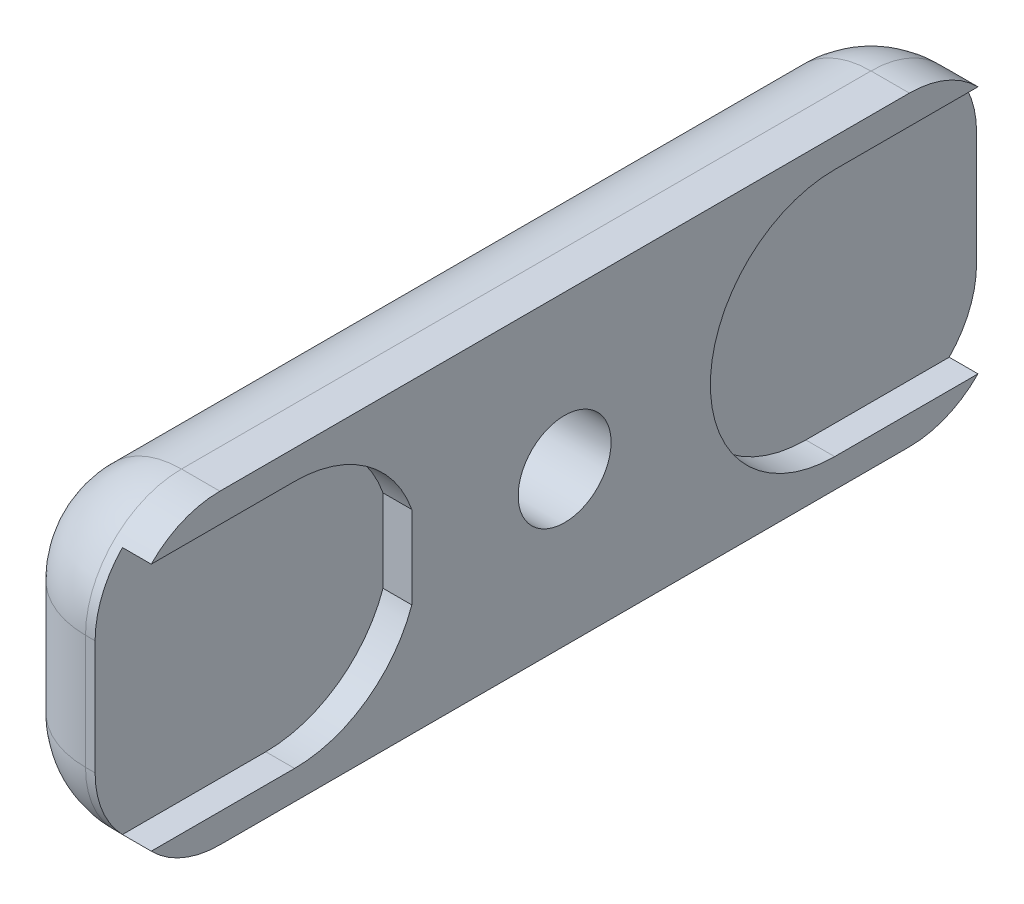
ISO-10303-21;
HEADER;
FILE_DESCRIPTION(('STEP AP214'),'2;1');
FILE_NAME('part.step','',(''),(''),'','','');
FILE_SCHEMA(('AUTOMOTIVE_DESIGN { 1 0 10303 214 1 1 1 1 }'));
ENDSEC;
DATA;
#1=APPLICATION_CONTEXT('core data for automotive mechanical design processes');
#2=APPLICATION_PROTOCOL_DEFINITION('international standard','automotive_design',2000,#1);
#3=PRODUCT_CONTEXT('',#1,'mechanical');
#4=PRODUCT('Part','Part','',(#3));
#5=PRODUCT_RELATED_PRODUCT_CATEGORY('part','',(#4));
#6=PRODUCT_DEFINITION_FORMATION('','',#4);
#7=PRODUCT_DEFINITION_CONTEXT('part definition',#1,'design');
#8=PRODUCT_DEFINITION('design','',#6,#7);
#9=PRODUCT_DEFINITION_SHAPE('','',#8);
#10=(LENGTH_UNIT() NAMED_UNIT(*) SI_UNIT(.MILLI.,.METRE.));
#11=(NAMED_UNIT(*) PLANE_ANGLE_UNIT() SI_UNIT($,.RADIAN.));
#12=(NAMED_UNIT(*) SI_UNIT($,.STERADIAN.) SOLID_ANGLE_UNIT());
#13=UNCERTAINTY_MEASURE_WITH_UNIT(LENGTH_MEASURE(1.E-05),#10,'distance_accuracy_value','');
#14=(GEOMETRIC_REPRESENTATION_CONTEXT(3) GLOBAL_UNCERTAINTY_ASSIGNED_CONTEXT((#13)) GLOBAL_UNIT_ASSIGNED_CONTEXT((#10,
#11,#12)) REPRESENTATION_CONTEXT('',''));
#15=CARTESIAN_POINT('',(0.,0.,0.));
#16=DIRECTION('',(0.,0.,1.));
#17=DIRECTION('',(1.,0.,0.));
#18=AXIS2_PLACEMENT_3D('',#15,#16,#17);
#19=CARTESIAN_POINT('',(14.,18.9686177509747,49.0539869213552));
#20=DIRECTION('',(0.,0.,-1.));
#21=DIRECTION('',(0.,1.,0.));
#22=AXIS2_PLACEMENT_3D('',#19,#20,#21);
#23=PLANE('',#22);
#24=DIRECTION('',(0.,-1.,0.));
#25=VECTOR('',#24,1.);
#26=CARTESIAN_POINT('',(11.,-12.95,49.0539869213552));
#27=LINE('',#26,#25);
#28=CARTESIAN_POINT('',(11.,5.95930887548733,49.0539869213552));
#29=VERTEX_POINT('',#28);
#30=CARTESIAN_POINT('',(11.,-5.95930887548734,49.0539869213552));
#31=VERTEX_POINT('',#30);
#32=EDGE_CURVE('E238',#29,#31,#27,.T.);
#33=ORIENTED_EDGE('',*,*,#32,.F.);
#34=DIRECTION('',(1.,0.,0.));
#35=VECTOR('',#34,1.);
#36=CARTESIAN_POINT('',(14.,5.95930887548733,49.0539869213552));
#37=LINE('',#36,#35);
#38=CARTESIAN_POINT('',(10.,5.95930887548733,49.0539869213552));
#39=VERTEX_POINT('',#38);
#40=EDGE_CURVE('E11',#29,#39,#37,.F.);
#41=ORIENTED_EDGE('',*,*,#40,.T.);
#42=DIRECTION('',(0.,-1.,0.));
#43=VECTOR('',#42,1.);
#44=CARTESIAN_POINT('',(10.,18.9686177509747,49.0539869213552));
#45=LINE('',#44,#43);
#46=CARTESIAN_POINT('',(10.,-5.95930887548733,49.0539869213552));
#47=VERTEX_POINT('',#46);
#48=EDGE_CURVE('E299',#39,#47,#45,.T.);
#49=ORIENTED_EDGE('',*,*,#48,.T.);
#50=DIRECTION('',(1.,0.,0.));
#51=VECTOR('',#50,1.);
#52=CARTESIAN_POINT('',(14.,-5.95930887548734,49.0539869213552));
#53=LINE('',#52,#51);
#54=EDGE_CURVE('E290',#47,#31,#53,.T.);
#55=ORIENTED_EDGE('',*,*,#54,.T.);
#56=EDGE_LOOP('',(#33,#41,#49,#55));
#57=FACE_BOUND('',#56,.T.);
#58=ADVANCED_FACE('F50',(#57),#23,.F.);
#59=CARTESIAN_POINT('',(14.,-28.9686177509747,3.13232637331732));
#60=DIRECTION('',(1.,0.,0.));
#61=DIRECTION('',(0.,0.,-1.));
#62=AXIS2_PLACEMENT_3D('',#59,#60,#61);
#63=PLANE('',#62);
#64=DIRECTION('',(0.,0.,-1.));
#65=VECTOR('',#64,1.);
#66=CARTESIAN_POINT('',(14.,12.95,-25.0030511371958));
#67=LINE('',#66,#65);
#68=CARTESIAN_POINT('',(14.,12.95,-25.0030511371958));
#69=VERTEX_POINT('',#68);
#70=CARTESIAN_POINT('',(14.,12.95,-39.9398752452733));
#71=VERTEX_POINT('',#70);
#72=EDGE_CURVE('E203',#69,#71,#67,.T.);
#73=ORIENTED_EDGE('',*,*,#72,.T.);
#74=CARTESIAN_POINT('',(14.,5.95930887548733,-32.7893341747207));
#75=DIRECTION('',(1.,0.,0.));
#76=DIRECTION('',(0.,0.,-1.));
#77=AXIS2_PLACEMENT_3D('',#74,#75,#76);
#78=CIRCLE('',#77,10.);
#79=CARTESIAN_POINT('',(14.,15.9593088754873,-32.7893341747207));
#80=VERTEX_POINT('',#79);
#81=EDGE_CURVE('E335',#71,#80,#78,.T.);
#82=ORIENTED_EDGE('',*,*,#81,.T.);
#83=DIRECTION('',(0.,0.,-1.));
#84=VECTOR('',#83,1.);
#85=CARTESIAN_POINT('',(14.,15.9593088754873,49.0539869213552));
#86=LINE('',#85,#84);
#87=CARTESIAN_POINT('',(14.,15.9593088754873,39.0539869213552));
#88=VERTEX_POINT('',#87);
#89=EDGE_CURVE('E298',#88,#80,#86,.T.);
#90=ORIENTED_EDGE('',*,*,#89,.F.);
#91=CARTESIAN_POINT('',(14.,5.95930887548733,39.0539869213552));
#92=DIRECTION('',(1.,0.,0.));
#93=DIRECTION('',(0.,0.,-1.));
#94=AXIS2_PLACEMENT_3D('',#91,#92,#93);
#95=CIRCLE('',#94,10.);
#96=CARTESIAN_POINT('',(14.,12.95,46.2045279919078));
#97=VERTEX_POINT('',#96);
#98=EDGE_CURVE('E332',#88,#97,#95,.T.);
#99=ORIENTED_EDGE('',*,*,#98,.T.);
#100=DIRECTION('',(0.,0.,1.));
#101=VECTOR('',#100,1.);
#102=CARTESIAN_POINT('',(14.,12.95,31.2677038838304));
#103=LINE('',#102,#101);
#104=CARTESIAN_POINT('',(14.,12.95,31.2677038838304));
#105=VERTEX_POINT('',#104);
#106=EDGE_CURVE('E241',#105,#97,#103,.T.);
#107=ORIENTED_EDGE('',*,*,#106,.F.);
#108=CARTESIAN_POINT('',(14.,0.,31.2677038838304));
#109=DIRECTION('',(1.,0.,0.));
#110=DIRECTION('',(0.,0.,-1.));
#111=AXIS2_PLACEMENT_3D('',#108,#109,#110);
#112=CIRCLE('',#111,12.95);
#113=CARTESIAN_POINT('',(14.,4.30437195889774,19.0539869213552));
#114=VERTEX_POINT('',#113);
#115=EDGE_CURVE('E249',#114,#105,#112,.T.);
#116=ORIENTED_EDGE('',*,*,#115,.F.);
#117=DIRECTION('',(0.,1.,0.));
#118=VECTOR('',#117,1.);
#119=CARTESIAN_POINT('',(14.,-28.9686177509747,19.0539869213552));
#120=LINE('',#119,#118);
#121=CARTESIAN_POINT('',(14.,-4.30437195889774,19.0539869213552));
#122=VERTEX_POINT('',#121);
#123=EDGE_CURVE('E230',#122,#114,#120,.T.);
#124=ORIENTED_EDGE('',*,*,#123,.F.);
#125=CARTESIAN_POINT('',(14.,-12.95,31.2677038838304));
#126=VERTEX_POINT('',#125);
#127=EDGE_CURVE('E252',#126,#122,#112,.T.);
#128=ORIENTED_EDGE('',*,*,#127,.F.);
#129=DIRECTION('',(0.,0.,-1.));
#130=VECTOR('',#129,1.);
#131=CARTESIAN_POINT('',(14.,-12.95,49.0539869213552));
#132=LINE('',#131,#130);
#133=CARTESIAN_POINT('',(14.,-12.95,46.2045279919078));
#134=VERTEX_POINT('',#133);
#135=EDGE_CURVE('E240',#134,#126,#132,.T.);
#136=ORIENTED_EDGE('',*,*,#135,.F.);
#137=CARTESIAN_POINT('',(14.,-5.95930887548733,39.0539869213552));
#138=DIRECTION('',(1.,0.,0.));
#139=DIRECTION('',(0.,0.,-1.));
#140=AXIS2_PLACEMENT_3D('',#137,#138,#139);
#141=CIRCLE('',#140,10.);
#142=CARTESIAN_POINT('',(14.,-15.9593088754873,39.0539869213552));
#143=VERTEX_POINT('',#142);
#144=EDGE_CURVE('E309',#134,#143,#141,.T.);
#145=ORIENTED_EDGE('',*,*,#144,.T.);
#146=DIRECTION('',(0.,0.,1.));
#147=VECTOR('',#146,1.);
#148=CARTESIAN_POINT('',(14.,-15.9593088754873,49.0539869213552));
#149=LINE('',#148,#147);
#150=CARTESIAN_POINT('',(14.,-15.9593088754873,-32.7893341747207));
#151=VERTEX_POINT('',#150);
#152=EDGE_CURVE('E222',#151,#143,#149,.T.);
#153=ORIENTED_EDGE('',*,*,#152,.F.);
#154=CARTESIAN_POINT('',(14.,-5.95930887548733,-32.7893341747207));
#155=DIRECTION('',(1.,0.,0.));
#156=DIRECTION('',(0.,0.,-1.));
#157=AXIS2_PLACEMENT_3D('',#154,#155,#156);
#158=CIRCLE('',#157,10.);
#159=CARTESIAN_POINT('',(14.,-12.95,-39.9398752452733));
#160=VERTEX_POINT('',#159);
#161=EDGE_CURVE('E281',#151,#160,#158,.T.);
#162=ORIENTED_EDGE('',*,*,#161,.T.);
#163=DIRECTION('',(0.,0.,1.));
#164=VECTOR('',#163,1.);
#165=CARTESIAN_POINT('',(14.,-12.95,-42.7893341747207));
#166=LINE('',#165,#164);
#167=CARTESIAN_POINT('',(14.,-12.95,-25.0030511371958));
#168=VERTEX_POINT('',#167);
#169=EDGE_CURVE('E215',#160,#168,#166,.T.);
#170=ORIENTED_EDGE('',*,*,#169,.T.);
#171=CARTESIAN_POINT('',(14.,0.,-25.0030511371959));
#172=DIRECTION('',(-1.,0.,0.));
#173=DIRECTION('',(0.,0.,1.));
#174=AXIS2_PLACEMENT_3D('',#171,#172,#173);
#175=CIRCLE('',#174,12.95);
#176=EDGE_CURVE('E220',#168,#69,#175,.T.);
#177=ORIENTED_EDGE('',*,*,#176,.T.);
#178=EDGE_LOOP('',(#73,#82,#90,#99,#107,#116,#124,#128,#136,#145,#153,#162,#170,#177));
#179=FACE_BOUND('',#178,.T.);
#180=CARTESIAN_POINT('',(14.,0.,3.13232637331727));
#181=DIRECTION('',(-1.,0.,0.));
#182=DIRECTION('',(0.,0.,1.));
#183=AXIS2_PLACEMENT_3D('',#180,#181,#182);
#184=CIRCLE('',#183,4.84);
#185=CARTESIAN_POINT('',(14.,0.,-1.70767362668273));
#186=VERTEX_POINT('',#185);
#187=EDGE_CURVE('E221',#186,#186,#184,.T.);
#188=ORIENTED_EDGE('',*,*,#187,.T.);
#189=EDGE_LOOP('',(#188));
#190=FACE_BOUND('',#189,.T.);
#191=ADVANCED_FACE('F368',(#179,#190),#63,.T.);
#192=CARTESIAN_POINT('',(14.,18.9686177509747,-42.7893341747207));
#193=DIRECTION('',(0.,0.,-1.));
#194=DIRECTION('',(0.,1.,0.));
#195=AXIS2_PLACEMENT_3D('',#192,#193,#194);
#196=PLANE('',#195);
#197=DIRECTION('',(0.,-1.,0.));
#198=VECTOR('',#197,1.);
#199=CARTESIAN_POINT('',(10.,15.9593088754873,-42.7893341747207));
#200=LINE('',#199,#198);
#201=CARTESIAN_POINT('',(10.,-5.95930887548734,-42.7893341747207));
#202=VERTEX_POINT('',#201);
#203=CARTESIAN_POINT('',(10.,5.95930887548733,-42.7893341747207));
#204=VERTEX_POINT('',#203);
#205=EDGE_CURVE('E271',#202,#204,#200,.F.);
#206=ORIENTED_EDGE('',*,*,#205,.T.);
#207=DIRECTION('',(-1.,0.,0.));
#208=VECTOR('',#207,1.);
#209=CARTESIAN_POINT('',(14.,5.95930887548733,-42.7893341747207));
#210=LINE('',#209,#208);
#211=CARTESIAN_POINT('',(11.,5.95930887548733,-42.7893341747207));
#212=VERTEX_POINT('',#211);
#213=EDGE_CURVE('E326',#204,#212,#210,.F.);
#214=ORIENTED_EDGE('',*,*,#213,.T.);
#215=DIRECTION('',(0.,-1.,0.));
#216=VECTOR('',#215,1.);
#217=CARTESIAN_POINT('',(11.,-12.95,-42.7893341747207));
#218=LINE('',#217,#216);
#219=CARTESIAN_POINT('',(11.,-5.95930887548734,-42.7893341747207));
#220=VERTEX_POINT('',#219);
#221=EDGE_CURVE('E214',#212,#220,#218,.T.);
#222=ORIENTED_EDGE('',*,*,#221,.T.);
#223=DIRECTION('',(1.,0.,0.));
#224=VECTOR('',#223,1.);
#225=CARTESIAN_POINT('',(10.,-5.95930887548734,-42.7893341747207));
#226=LINE('',#225,#224);
#227=EDGE_CURVE('E272',#220,#202,#226,.F.);
#228=ORIENTED_EDGE('',*,*,#227,.T.);
#229=EDGE_LOOP('',(#206,#214,#222,#228));
#230=FACE_BOUND('',#229,.T.);
#231=ADVANCED_FACE('F445',(#230),#196,.T.);
#232=CARTESIAN_POINT('',(11.,0.,31.2677038838304));
#233=DIRECTION('',(1.,0.,0.));
#234=DIRECTION('',(0.,0.,-1.));
#235=AXIS2_PLACEMENT_3D('',#232,#233,#234);
#236=CYLINDRICAL_SURFACE('',#235,12.95);
#237=ORIENTED_EDGE('',*,*,#127,.T.);
#238=DIRECTION('',(1.,0.,0.));
#239=VECTOR('',#238,1.);
#240=CARTESIAN_POINT('',(11.,-4.30437195889775,19.0539869213552));
#241=LINE('',#240,#239);
#242=CARTESIAN_POINT('',(11.,-4.30437195889774,19.0539869213552));
#243=VERTEX_POINT('',#242);
#244=EDGE_CURVE('E234',#122,#243,#241,.F.);
#245=ORIENTED_EDGE('',*,*,#244,.T.);
#246=CARTESIAN_POINT('',(11.,0.,31.2677038838304));
#247=DIRECTION('',(1.,0.,0.));
#248=DIRECTION('',(0.,0.,-1.));
#249=AXIS2_PLACEMENT_3D('',#246,#247,#248);
#250=CIRCLE('',#249,12.95);
#251=CARTESIAN_POINT('',(11.,-12.95,31.2677038838304));
#252=VERTEX_POINT('',#251);
#253=EDGE_CURVE('E242',#252,#243,#250,.T.);
#254=ORIENTED_EDGE('',*,*,#253,.F.);
#255=DIRECTION('',(1.,0.,0.));
#256=VECTOR('',#255,1.);
#257=CARTESIAN_POINT('',(11.,-12.95,31.2677038838304));
#258=LINE('',#257,#256);
#259=EDGE_CURVE('E247',#252,#126,#258,.T.);
#260=ORIENTED_EDGE('',*,*,#259,.T.);
#261=EDGE_LOOP('',(#237,#245,#254,#260));
#262=FACE_BOUND('',#261,.T.);
#263=ADVANCED_FACE('F412',(#262),#236,.F.);
#264=CARTESIAN_POINT('',(0.,-28.9686177509747,3.13232637331732));
#265=DIRECTION('',(1.,0.,0.));
#266=DIRECTION('',(0.,0.,-1.));
#267=AXIS2_PLACEMENT_3D('',#264,#265,#266);
#268=PLANE('',#267);
#269=CARTESIAN_POINT('',(0.,0.,3.13232637331727));
#270=DIRECTION('',(1.,0.,0.));
#271=DIRECTION('',(0.,0.,-1.));
#272=AXIS2_PLACEMENT_3D('',#269,#270,#271);
#273=CIRCLE('',#272,4.84);
#274=CARTESIAN_POINT('',(0.,0.,-1.70767362668273));
#275=VERTEX_POINT('',#274);
#276=EDGE_CURVE('E226',#275,#275,#273,.F.);
#277=ORIENTED_EDGE('',*,*,#276,.F.);
#278=EDGE_LOOP('',(#277));
#279=FACE_BOUND('',#278,.T.);
#280=DIRECTION('',(0.,-1.,0.));
#281=VECTOR('',#280,1.);
#282=CARTESIAN_POINT('',(0.,-28.9686177509747,39.0539869213552));
#283=LINE('',#282,#281);
#284=CARTESIAN_POINT('',(0.,-5.95930887548734,39.0539869213552));
#285=VERTEX_POINT('',#284);
#286=CARTESIAN_POINT('',(0.,5.95930887548734,39.0539869213552));
#287=VERTEX_POINT('',#286);
#288=EDGE_CURVE('E301',#285,#287,#283,.F.);
#289=ORIENTED_EDGE('',*,*,#288,.T.);
#290=DIRECTION('',(0.,0.,-1.));
#291=VECTOR('',#290,1.);
#292=CARTESIAN_POINT('',(0.,5.95930887548734,3.13232637331732));
#293=LINE('',#292,#291);
#294=CARTESIAN_POINT('',(0.,5.95930887548734,-32.7893341747207));
#295=VERTEX_POINT('',#294);
#296=EDGE_CURVE('E340',#287,#295,#293,.T.);
#297=ORIENTED_EDGE('',*,*,#296,.T.);
#298=DIRECTION('',(0.,-1.,0.));
#299=VECTOR('',#298,1.);
#300=CARTESIAN_POINT('',(0.,-5.95930887548733,-32.7893341747207));
#301=LINE('',#300,#299);
#302=CARTESIAN_POINT('',(0.,-5.95930887548734,-32.7893341747207));
#303=VERTEX_POINT('',#302);
#304=EDGE_CURVE('E266',#295,#303,#301,.T.);
#305=ORIENTED_EDGE('',*,*,#304,.T.);
#306=DIRECTION('',(0.,0.,1.));
#307=VECTOR('',#306,1.);
#308=CARTESIAN_POINT('',(0.,-5.95930887548734,3.13232637331732));
#309=LINE('',#308,#307);
#310=EDGE_CURVE('E262',#303,#285,#309,.T.);
#311=ORIENTED_EDGE('',*,*,#310,.T.);
#312=EDGE_LOOP('',(#289,#297,#305,#311));
#313=FACE_BOUND('',#312,.T.);
#314=ADVANCED_FACE('F399',(#279,#313),#268,.F.);
#315=CARTESIAN_POINT('',(11.,12.95,31.2677038838304));
#316=DIRECTION('',(0.,1.,0.));
#317=DIRECTION('',(0.,0.,1.));
#318=AXIS2_PLACEMENT_3D('',#315,#316,#317);
#319=PLANE('',#318);
#320=ORIENTED_EDGE('',*,*,#106,.T.);
#321=DIRECTION('',(1.,0.,0.));
#322=VECTOR('',#321,1.);
#323=CARTESIAN_POINT('',(14.,12.95,46.2045279919078));
#324=LINE('',#323,#322);
#325=CARTESIAN_POINT('',(11.,12.95,46.2045279919078));
#326=VERTEX_POINT('',#325);
#327=EDGE_CURVE('E72',#97,#326,#324,.F.);
#328=ORIENTED_EDGE('',*,*,#327,.T.);
#329=DIRECTION('',(0.,0.,1.));
#330=VECTOR('',#329,1.);
#331=CARTESIAN_POINT('',(11.,12.95,31.2677038838304));
#332=LINE('',#331,#330);
#333=CARTESIAN_POINT('',(11.,12.95,31.2677038838304));
#334=VERTEX_POINT('',#333);
#335=EDGE_CURVE('E246',#334,#326,#332,.T.);
#336=ORIENTED_EDGE('',*,*,#335,.F.);
#337=DIRECTION('',(1.,0.,0.));
#338=VECTOR('',#337,1.);
#339=CARTESIAN_POINT('',(11.,12.95,31.2677038838304));
#340=LINE('',#339,#338);
#341=EDGE_CURVE('E251',#334,#105,#340,.T.);
#342=ORIENTED_EDGE('',*,*,#341,.T.);
#343=EDGE_LOOP('',(#320,#328,#336,#342));
#344=FACE_BOUND('',#343,.T.);
#345=ADVANCED_FACE('F421',(#344),#319,.F.);
#346=CARTESIAN_POINT('',(11.,4.30437195889774,19.0539869213552));
#347=VERTEX_POINT('',#346);
#348=EDGE_CURVE('E243',#347,#334,#250,.T.);
#349=ORIENTED_EDGE('',*,*,#348,.F.);
#350=DIRECTION('',(1.,0.,0.));
#351=VECTOR('',#350,1.);
#352=CARTESIAN_POINT('',(11.,4.30437195889775,19.0539869213552));
#353=LINE('',#352,#351);
#354=EDGE_CURVE('E235',#347,#114,#353,.T.);
#355=ORIENTED_EDGE('',*,*,#354,.T.);
#356=ORIENTED_EDGE('',*,*,#115,.T.);
#357=ORIENTED_EDGE('',*,*,#341,.F.);
#358=EDGE_LOOP('',(#349,#355,#356,#357));
#359=FACE_BOUND('',#358,.T.);
#360=ADVANCED_FACE('F416',(#359),#236,.F.);
#361=CARTESIAN_POINT('',(11.,-12.95,49.0539869213552));
#362=DIRECTION('',(0.,-1.,0.));
#363=DIRECTION('',(0.,0.,-1.));
#364=AXIS2_PLACEMENT_3D('',#361,#362,#363);
#365=PLANE('',#364);
#366=DIRECTION('',(0.,0.,-1.));
#367=VECTOR('',#366,1.);
#368=CARTESIAN_POINT('',(11.,-12.95,49.0539869213552));
#369=LINE('',#368,#367);
#370=CARTESIAN_POINT('',(11.,-12.95,46.2045279919078));
#371=VERTEX_POINT('',#370);
#372=EDGE_CURVE('E239',#371,#252,#369,.T.);
#373=ORIENTED_EDGE('',*,*,#372,.F.);
#374=DIRECTION('',(1.,0.,0.));
#375=VECTOR('',#374,1.);
#376=CARTESIAN_POINT('',(11.,-12.95,46.2045279919078));
#377=LINE('',#376,#375);
#378=EDGE_CURVE('E308',#371,#134,#377,.T.);
#379=ORIENTED_EDGE('',*,*,#378,.T.);
#380=ORIENTED_EDGE('',*,*,#135,.T.);
#381=ORIENTED_EDGE('',*,*,#259,.F.);
#382=EDGE_LOOP('',(#373,#379,#380,#381));
#383=FACE_BOUND('',#382,.T.);
#384=ADVANCED_FACE('F409',(#383),#365,.F.);
#385=CARTESIAN_POINT('',(11.,0.,31.2677038838304));
#386=DIRECTION('',(1.,0.,0.));
#387=DIRECTION('',(0.,0.,-1.));
#388=AXIS2_PLACEMENT_3D('',#385,#386,#387);
#389=PLANE('',#388);
#390=ORIENTED_EDGE('',*,*,#335,.T.);
#391=CARTESIAN_POINT('',(11.,5.95930887548733,39.0539869213552));
#392=DIRECTION('',(1.,0.,0.));
#393=DIRECTION('',(0.,0.,-1.));
#394=AXIS2_PLACEMENT_3D('',#391,#392,#393);
#395=CIRCLE('',#394,10.);
#396=EDGE_CURVE('E57',#326,#29,#395,.T.);
#397=ORIENTED_EDGE('',*,*,#396,.T.);
#398=ORIENTED_EDGE('',*,*,#32,.T.);
#399=CARTESIAN_POINT('',(11.,-5.95930887548733,39.0539869213552));
#400=DIRECTION('',(1.,0.,0.));
#401=DIRECTION('',(0.,0.,-1.));
#402=AXIS2_PLACEMENT_3D('',#399,#400,#401);
#403=CIRCLE('',#402,10.);
#404=EDGE_CURVE('E306',#31,#371,#403,.T.);
#405=ORIENTED_EDGE('',*,*,#404,.T.);
#406=ORIENTED_EDGE('',*,*,#372,.T.);
#407=ORIENTED_EDGE('',*,*,#253,.T.);
#408=DIRECTION('',(0.,-1.,0.));
#409=VECTOR('',#408,1.);
#410=CARTESIAN_POINT('',(11.,0.,19.0539869213552));
#411=LINE('',#410,#409);
#412=EDGE_CURVE('E259',#347,#243,#411,.T.);
#413=ORIENTED_EDGE('',*,*,#412,.F.);
#414=ORIENTED_EDGE('',*,*,#348,.T.);
#415=EDGE_LOOP('',(#390,#397,#398,#405,#406,#407,#413,#414));
#416=FACE_BOUND('',#415,.T.);
#417=ADVANCED_FACE('F401',(#416),#389,.T.);
#418=CARTESIAN_POINT('',(14.,-28.9686177509747,19.0539869213552));
#419=DIRECTION('',(0.,0.,1.));
#420=DIRECTION('',(1.,0.,0.));
#421=AXIS2_PLACEMENT_3D('',#418,#419,#420);
#422=PLANE('',#421);
#423=ORIENTED_EDGE('',*,*,#244,.F.);
#424=ORIENTED_EDGE('',*,*,#123,.T.);
#425=ORIENTED_EDGE('',*,*,#354,.F.);
#426=ORIENTED_EDGE('',*,*,#412,.T.);
#427=EDGE_LOOP('',(#423,#424,#425,#426));
#428=FACE_BOUND('',#427,.T.);
#429=ADVANCED_FACE('F423',(#428),#422,.T.);
#430=CARTESIAN_POINT('',(-0.0461999999999997,0.,3.13232637331727));
#431=DIRECTION('',(1.,0.,0.));
#432=DIRECTION('',(0.,0.,-1.));
#433=AXIS2_PLACEMENT_3D('',#430,#431,#432);
#434=CYLINDRICAL_SURFACE('',#433,4.84);
#435=CARTESIAN_POINT('',(14.,0.,-1.70767362668273));
#436=CARTESIAN_POINT('',(13.8541666666667,0.,-1.70767362668273));
#437=CARTESIAN_POINT('',(13.7083333333333,0.,-1.70767362668273));
#438=CARTESIAN_POINT('',(13.4166666666667,0.,-1.70767362668273));
#439=CARTESIAN_POINT('',(13.2708333333333,0.,-1.70767362668273));
#440=CARTESIAN_POINT('',(12.9791666666667,0.,-1.70767362668273));
#441=CARTESIAN_POINT('',(12.8333333333333,0.,-1.70767362668273));
#442=CARTESIAN_POINT('',(12.5416666666667,0.,-1.70767362668273));
#443=CARTESIAN_POINT('',(12.3958333333333,0.,-1.70767362668273));
#444=CARTESIAN_POINT('',(12.1041666666667,0.,-1.70767362668273));
#445=CARTESIAN_POINT('',(11.9583333333333,0.,-1.70767362668273));
#446=CARTESIAN_POINT('',(11.6666666666667,0.,-1.70767362668273));
#447=CARTESIAN_POINT('',(11.5208333333333,0.,-1.70767362668273));
#448=CARTESIAN_POINT('',(11.2291666666667,0.,-1.70767362668273));
#449=CARTESIAN_POINT('',(11.0833333333333,0.,-1.70767362668273));
#450=CARTESIAN_POINT('',(10.7916666666667,0.,-1.70767362668273));
#451=CARTESIAN_POINT('',(10.6458333333333,0.,-1.70767362668273));
#452=CARTESIAN_POINT('',(10.3541666666667,0.,-1.70767362668273));
#453=CARTESIAN_POINT('',(10.2083333333333,0.,-1.70767362668273));
#454=CARTESIAN_POINT('',(9.91666666666667,0.,-1.70767362668273));
#455=CARTESIAN_POINT('',(9.77083333333333,0.,-1.70767362668273));
#456=CARTESIAN_POINT('',(9.47916666666667,0.,-1.70767362668273));
#457=CARTESIAN_POINT('',(9.33333333333333,0.,-1.70767362668273));
#458=CARTESIAN_POINT('',(9.04166666666667,0.,-1.70767362668273));
#459=CARTESIAN_POINT('',(8.89583333333333,0.,-1.70767362668273));
#460=CARTESIAN_POINT('',(8.60416666666667,0.,-1.70767362668273));
#461=CARTESIAN_POINT('',(8.45833333333333,0.,-1.70767362668273));
#462=CARTESIAN_POINT('',(8.16666666666667,0.,-1.70767362668273));
#463=CARTESIAN_POINT('',(8.02083333333333,0.,-1.70767362668273));
#464=CARTESIAN_POINT('',(7.72916666666667,0.,-1.70767362668273));
#465=CARTESIAN_POINT('',(7.58333333333333,0.,-1.70767362668273));
#466=CARTESIAN_POINT('',(7.29166666666667,0.,-1.70767362668273));
#467=CARTESIAN_POINT('',(7.14583333333333,0.,-1.70767362668273));
#468=CARTESIAN_POINT('',(6.85416666666667,0.,-1.70767362668273));
#469=CARTESIAN_POINT('',(6.70833333333333,0.,-1.70767362668273));
#470=CARTESIAN_POINT('',(6.41666666666667,0.,-1.70767362668273));
#471=CARTESIAN_POINT('',(6.27083333333333,0.,-1.70767362668273));
#472=CARTESIAN_POINT('',(5.97916666666667,0.,-1.70767362668273));
#473=CARTESIAN_POINT('',(5.83333333333333,0.,-1.70767362668273));
#474=CARTESIAN_POINT('',(5.54166666666667,0.,-1.70767362668273));
#475=CARTESIAN_POINT('',(5.39583333333333,0.,-1.70767362668273));
#476=CARTESIAN_POINT('',(5.10416666666667,0.,-1.70767362668273));
#477=CARTESIAN_POINT('',(4.95833333333333,0.,-1.70767362668273));
#478=CARTESIAN_POINT('',(4.66666666666667,0.,-1.70767362668273));
#479=CARTESIAN_POINT('',(4.52083333333333,0.,-1.70767362668273));
#480=CARTESIAN_POINT('',(4.22916666666667,0.,-1.70767362668273));
#481=CARTESIAN_POINT('',(4.08333333333333,0.,-1.70767362668273));
#482=CARTESIAN_POINT('',(3.79166666666667,0.,-1.70767362668273));
#483=CARTESIAN_POINT('',(3.64583333333333,0.,-1.70767362668273));
#484=CARTESIAN_POINT('',(3.35416666666667,0.,-1.70767362668273));
#485=CARTESIAN_POINT('',(3.20833333333333,0.,-1.70767362668273));
#486=CARTESIAN_POINT('',(2.91666666666667,0.,-1.70767362668273));
#487=CARTESIAN_POINT('',(2.77083333333333,0.,-1.70767362668273));
#488=CARTESIAN_POINT('',(2.47916666666667,0.,-1.70767362668273));
#489=CARTESIAN_POINT('',(2.33333333333333,0.,-1.70767362668273));
#490=CARTESIAN_POINT('',(2.04166666666667,0.,-1.70767362668273));
#491=CARTESIAN_POINT('',(1.89583333333333,0.,-1.70767362668273));
#492=CARTESIAN_POINT('',(1.60416666666667,0.,-1.70767362668273));
#493=CARTESIAN_POINT('',(1.45833333333333,0.,-1.70767362668273));
#494=CARTESIAN_POINT('',(1.16666666666667,0.,-1.70767362668273));
#495=CARTESIAN_POINT('',(1.02083333333333,0.,-1.70767362668273));
#496=CARTESIAN_POINT('',(0.729166666666667,0.,-1.70767362668273));
#497=CARTESIAN_POINT('',(0.583333333333334,0.,-1.70767362668273));
#498=CARTESIAN_POINT('',(0.291666666666667,0.,-1.70767362668273));
#499=CARTESIAN_POINT('',(0.145833333333333,0.,-1.70767362668273));
#500=CARTESIAN_POINT('',(0.,0.,-1.70767362668273));
#501=B_SPLINE_CURVE_WITH_KNOTS('',3,(#435,#436,#437,#438,#439,#440,#441,#442,#443,#444,#445,
#446,#447,#448,#449,#450,#451,#452,#453,#454,#455,#456,#457,#458,#459,#460,#461,#462,#463,#464,
#465,#466,#467,#468,#469,#470,#471,#472,#473,#474,#475,#476,#477,#478,#479,#480,#481,#482,#483,
#484,#485,#486,#487,#488,#489,#490,#491,#492,#493,#494,#495,#496,#497,#498,#499,#500),
.UNSPECIFIED.,.F.,.F.,(4,2,2,2,2,2,2,2,2,2,2,2,2,2,2,2,2,2,2,2,2,2,2,2,2,2,2,2,2,2,2,2,4),(0.,
0.4375,0.875000000000001,1.3125,1.75,2.1875,2.625,3.0625,3.5,3.9375,4.375,4.8125,5.25,5.6875,
6.125,6.5625,7.,7.4375,7.875,8.3125,8.75,9.1875,9.625,10.0625,10.5,10.9375,11.375,11.8125,12.25,
12.6875,13.125,13.5625,14.),.UNSPECIFIED.);
#502=EDGE_CURVE('BSEAM551',#186,#275,#501,.T.);
#503=ORIENTED_EDGE('',*,*,#187,.F.);
#504=ORIENTED_EDGE('',*,*,#276,.T.);
#505=ORIENTED_EDGE('',*,*,#502,.T.);
#506=ORIENTED_EDGE('',*,*,#502,.F.);
#507=EDGE_LOOP('',(#503,#505,#504,#506));
#508=FACE_BOUND('',#507,.T.);
#509=ADVANCED_FACE('F551',(#508),#434,.F.);
#510=CARTESIAN_POINT('',(11.,-12.95,-42.7893341747207));
#511=DIRECTION('',(0.,1.,0.));
#512=DIRECTION('',(0.,0.,1.));
#513=AXIS2_PLACEMENT_3D('',#510,#511,#512);
#514=PLANE('',#513);
#515=ORIENTED_EDGE('',*,*,#169,.F.);
#516=DIRECTION('',(-1.,0.,0.));
#517=VECTOR('',#516,1.);
#518=CARTESIAN_POINT('',(14.,-12.95,-39.9398752452733));
#519=LINE('',#518,#517);
#520=CARTESIAN_POINT('',(11.,-12.95,-39.9398752452733));
#521=VERTEX_POINT('',#520);
#522=EDGE_CURVE('E284',#160,#521,#519,.T.);
#523=ORIENTED_EDGE('',*,*,#522,.T.);
#524=DIRECTION('',(0.,0.,1.));
#525=VECTOR('',#524,1.);
#526=CARTESIAN_POINT('',(11.,-12.95,-42.7893341747207));
#527=LINE('',#526,#525);
#528=CARTESIAN_POINT('',(11.,-12.95,-25.0030511371958));
#529=VERTEX_POINT('',#528);
#530=EDGE_CURVE('E197',#521,#529,#527,.T.);
#531=ORIENTED_EDGE('',*,*,#530,.T.);
#532=DIRECTION('',(1.,0.,0.));
#533=VECTOR('',#532,1.);
#534=CARTESIAN_POINT('',(11.,-12.95,-25.0030511371958));
#535=LINE('',#534,#533);
#536=EDGE_CURVE('E192',#529,#168,#535,.T.);
#537=ORIENTED_EDGE('',*,*,#536,.T.);
#538=EDGE_LOOP('',(#515,#523,#531,#537));
#539=FACE_BOUND('',#538,.T.);
#540=ADVANCED_FACE('F565',(#539),#514,.T.);
#541=CARTESIAN_POINT('',(11.,0.,-25.0030511371959));
#542=DIRECTION('',(1.,0.,0.));
#543=DIRECTION('',(0.,0.,-1.));
#544=AXIS2_PLACEMENT_3D('',#541,#542,#543);
#545=CYLINDRICAL_SURFACE('',#544,12.95);
#546=ORIENTED_EDGE('',*,*,#176,.F.);
#547=ORIENTED_EDGE('',*,*,#536,.F.);
#548=CARTESIAN_POINT('',(11.,0.,-25.0030511371959));
#549=DIRECTION('',(-1.,0.,0.));
#550=DIRECTION('',(0.,0.,1.));
#551=AXIS2_PLACEMENT_3D('',#548,#549,#550);
#552=CIRCLE('',#551,12.95);
#553=CARTESIAN_POINT('',(11.,12.95,-25.0030511371958));
#554=VERTEX_POINT('',#553);
#555=EDGE_CURVE('E187',#529,#554,#552,.T.);
#556=ORIENTED_EDGE('',*,*,#555,.T.);
#557=DIRECTION('',(1.,0.,0.));
#558=VECTOR('',#557,1.);
#559=CARTESIAN_POINT('',(11.,12.95,-25.0030511371958));
#560=LINE('',#559,#558);
#561=EDGE_CURVE('E188',#554,#69,#560,.T.);
#562=ORIENTED_EDGE('',*,*,#561,.T.);
#563=EDGE_LOOP('',(#546,#547,#556,#562));
#564=FACE_BOUND('',#563,.T.);
#565=ADVANCED_FACE('F186',(#564),#545,.F.);
#566=CARTESIAN_POINT('',(11.,12.95,-25.0030511371958));
#567=DIRECTION('',(0.,-1.,0.));
#568=DIRECTION('',(0.,0.,-1.));
#569=AXIS2_PLACEMENT_3D('',#566,#567,#568);
#570=PLANE('',#569);
#571=DIRECTION('',(0.,0.,-1.));
#572=VECTOR('',#571,1.);
#573=CARTESIAN_POINT('',(11.,12.95,-25.0030511371958));
#574=LINE('',#573,#572);
#575=CARTESIAN_POINT('',(11.,12.95,-39.9398752452733));
#576=VERTEX_POINT('',#575);
#577=EDGE_CURVE('E199',#554,#576,#574,.T.);
#578=ORIENTED_EDGE('',*,*,#577,.T.);
#579=DIRECTION('',(1.,0.,0.));
#580=VECTOR('',#579,1.);
#581=CARTESIAN_POINT('',(11.,12.95,-39.9398752452733));
#582=LINE('',#581,#580);
#583=EDGE_CURVE('E328',#576,#71,#582,.T.);
#584=ORIENTED_EDGE('',*,*,#583,.T.);
#585=ORIENTED_EDGE('',*,*,#72,.F.);
#586=ORIENTED_EDGE('',*,*,#561,.F.);
#587=EDGE_LOOP('',(#578,#584,#585,#586));
#588=FACE_BOUND('',#587,.T.);
#589=ADVANCED_FACE('F204',(#588),#570,.T.);
#590=CARTESIAN_POINT('',(11.,0.,-25.0030511371959));
#591=DIRECTION('',(1.,0.,0.));
#592=DIRECTION('',(0.,0.,1.));
#593=AXIS2_PLACEMENT_3D('',#590,#591,#592);
#594=PLANE('',#593);
#595=ORIENTED_EDGE('',*,*,#221,.F.);
#596=CARTESIAN_POINT('',(11.,5.95930887548733,-32.7893341747207));
#597=DIRECTION('',(1.,0.,0.));
#598=DIRECTION('',(0.,0.,-1.));
#599=AXIS2_PLACEMENT_3D('',#596,#597,#598);
#600=CIRCLE('',#599,10.);
#601=EDGE_CURVE('E213',#212,#576,#600,.T.);
#602=ORIENTED_EDGE('',*,*,#601,.T.);
#603=ORIENTED_EDGE('',*,*,#577,.F.);
#604=ORIENTED_EDGE('',*,*,#555,.F.);
#605=ORIENTED_EDGE('',*,*,#530,.F.);
#606=CARTESIAN_POINT('',(11.,-5.95930887548733,-32.7893341747207));
#607=DIRECTION('',(1.,0.,0.));
#608=DIRECTION('',(0.,0.,-1.));
#609=AXIS2_PLACEMENT_3D('',#606,#607,#608);
#610=CIRCLE('',#609,10.);
#611=EDGE_CURVE('E285',#521,#220,#610,.T.);
#612=ORIENTED_EDGE('',*,*,#611,.T.);
#613=EDGE_LOOP('',(#595,#602,#603,#604,#605,#612));
#614=FACE_BOUND('',#613,.T.);
#615=ADVANCED_FACE('F209',(#614),#594,.T.);
#616=CARTESIAN_POINT('',(0.,15.9593088754873,49.0539869213552));
#617=DIRECTION('',(0.,-1.,0.));
#618=DIRECTION('',(0.,0.,-1.));
#619=AXIS2_PLACEMENT_3D('',#616,#617,#618);
#620=PLANE('',#619);
#621=ORIENTED_EDGE('',*,*,#89,.T.);
#622=DIRECTION('',(-1.,0.,0.));
#623=VECTOR('',#622,1.);
#624=CARTESIAN_POINT('',(10.,15.9593088754873,-32.7893341747207));
#625=LINE('',#624,#623);
#626=CARTESIAN_POINT('',(10.,15.9593088754873,-32.7893341747207));
#627=VERTEX_POINT('',#626);
#628=EDGE_CURVE('E322',#80,#627,#625,.T.);
#629=ORIENTED_EDGE('',*,*,#628,.T.);
#630=DIRECTION('',(0.,0.,-1.));
#631=VECTOR('',#630,1.);
#632=CARTESIAN_POINT('',(10.,15.9593088754873,49.0539869213552));
#633=LINE('',#632,#631);
#634=CARTESIAN_POINT('',(10.,15.9593088754873,39.0539869213552));
#635=VERTEX_POINT('',#634);
#636=EDGE_CURVE('E323',#627,#635,#633,.F.);
#637=ORIENTED_EDGE('',*,*,#636,.T.);
#638=DIRECTION('',(1.,0.,0.));
#639=VECTOR('',#638,1.);
#640=CARTESIAN_POINT('',(0.,15.9593088754873,39.0539869213552));
#641=LINE('',#640,#639);
#642=EDGE_CURVE('E313',#635,#88,#641,.T.);
#643=ORIENTED_EDGE('',*,*,#642,.T.);
#644=EDGE_LOOP('',(#621,#629,#637,#643));
#645=FACE_BOUND('',#644,.T.);
#646=ADVANCED_FACE('F362',(#645),#620,.F.);
#647=CARTESIAN_POINT('',(0.,-15.9593088754873,49.0539869213552));
#648=DIRECTION('',(0.,1.,0.));
#649=DIRECTION('',(0.,0.,1.));
#650=AXIS2_PLACEMENT_3D('',#647,#648,#649);
#651=PLANE('',#650);
#652=ORIENTED_EDGE('',*,*,#152,.T.);
#653=DIRECTION('',(1.,0.,0.));
#654=VECTOR('',#653,1.);
#655=CARTESIAN_POINT('',(0.,-15.9593088754873,39.0539869213552));
#656=LINE('',#655,#654);
#657=CARTESIAN_POINT('',(10.,-15.9593088754873,39.0539869213552));
#658=VERTEX_POINT('',#657);
#659=EDGE_CURVE('E315',#143,#658,#656,.F.);
#660=ORIENTED_EDGE('',*,*,#659,.T.);
#661=DIRECTION('',(0.,0.,1.));
#662=VECTOR('',#661,1.);
#663=CARTESIAN_POINT('',(10.,-15.9593088754873,49.0539869213552));
#664=LINE('',#663,#662);
#665=CARTESIAN_POINT('',(10.,-15.9593088754873,-32.7893341747207));
#666=VERTEX_POINT('',#665);
#667=EDGE_CURVE('E269',#658,#666,#664,.F.);
#668=ORIENTED_EDGE('',*,*,#667,.T.);
#669=DIRECTION('',(1.,0.,0.));
#670=VECTOR('',#669,1.);
#671=CARTESIAN_POINT('',(14.,-15.9593088754873,-32.7893341747207));
#672=LINE('',#671,#670);
#673=EDGE_CURVE('E280',#666,#151,#672,.T.);
#674=ORIENTED_EDGE('',*,*,#673,.T.);
#675=EDGE_LOOP('',(#652,#660,#668,#674));
#676=FACE_BOUND('',#675,.T.);
#677=ADVANCED_FACE('F380',(#676),#651,.F.);
#678=CARTESIAN_POINT('',(10.,-5.95930887548734,3.13232637331732));
#679=DIRECTION('',(0.,0.,1.));
#680=DIRECTION('',(1.,0.,0.));
#681=AXIS2_PLACEMENT_3D('',#678,#679,#680);
#682=CYLINDRICAL_SURFACE('',#681,10.);
#683=ORIENTED_EDGE('',*,*,#667,.F.);
#684=CARTESIAN_POINT('',(10.,-5.95930887548734,39.0539869213552));
#685=DIRECTION('',(0.,0.,1.));
#686=DIRECTION('',(1.,0.,0.));
#687=AXIS2_PLACEMENT_3D('',#684,#685,#686);
#688=CIRCLE('',#687,10.);
#689=EDGE_CURVE('E302',#658,#285,#688,.F.);
#690=ORIENTED_EDGE('',*,*,#689,.T.);
#691=ORIENTED_EDGE('',*,*,#310,.F.);
#692=CARTESIAN_POINT('',(10.,-5.95930887548734,-32.7893341747207));
#693=DIRECTION('',(0.,0.,1.));
#694=DIRECTION('',(1.,0.,0.));
#695=AXIS2_PLACEMENT_3D('',#692,#693,#694);
#696=CIRCLE('',#695,10.);
#697=EDGE_CURVE('E278',#303,#666,#696,.T.);
#698=ORIENTED_EDGE('',*,*,#697,.T.);
#699=EDGE_LOOP('',(#683,#690,#691,#698));
#700=FACE_BOUND('',#699,.T.);
#701=ADVANCED_FACE('F393',(#700),#682,.T.);
#702=CARTESIAN_POINT('',(0.,-5.95930887548733,-32.7893341747207));
#703=DIRECTION('',(-1.,0.,0.));
#704=DIRECTION('',(0.,0.,1.));
#705=AXIS2_PLACEMENT_3D('',#702,#703,#704);
#706=CYLINDRICAL_SURFACE('',#705,10.);
#707=ORIENTED_EDGE('',*,*,#161,.F.);
#708=ORIENTED_EDGE('',*,*,#673,.F.);
#709=CARTESIAN_POINT('',(10.,-5.95930887548733,-32.7893341747207));
#710=DIRECTION('',(-1.,0.,0.));
#711=DIRECTION('',(0.,0.,1.));
#712=AXIS2_PLACEMENT_3D('',#709,#710,#711);
#713=CIRCLE('',#712,10.);
#714=EDGE_CURVE('E292',#202,#666,#713,.T.);
#715=ORIENTED_EDGE('',*,*,#714,.F.);
#716=ORIENTED_EDGE('',*,*,#227,.F.);
#717=ORIENTED_EDGE('',*,*,#611,.F.);
#718=ORIENTED_EDGE('',*,*,#522,.F.);
#719=EDGE_LOOP('',(#707,#708,#715,#716,#717,#718));
#720=FACE_BOUND('',#719,.T.);
#721=ADVANCED_FACE('F450',(#720),#706,.T.);
#722=CARTESIAN_POINT('',(10.,-5.95930887548734,-32.7893341747207));
#723=DIRECTION('',(0.,0.,-1.));
#724=DIRECTION('',(0.,1.,0.));
#725=AXIS2_PLACEMENT_3D('',#722,#723,#724);
#726=SPHERICAL_SURFACE('',#725,10.);
#727=ORIENTED_EDGE('',*,*,#714,.T.);
#728=ORIENTED_EDGE('',*,*,#697,.F.);
#729=CARTESIAN_POINT('',(10.,-5.95930887548734,-32.7893341747207));
#730=DIRECTION('',(0.,1.,0.));
#731=DIRECTION('',(0.,0.,1.));
#732=AXIS2_PLACEMENT_3D('',#729,#730,#731);
#733=CIRCLE('',#732,10.);
#734=EDGE_CURVE('E286',#202,#303,#733,.T.);
#735=ORIENTED_EDGE('',*,*,#734,.F.);
#736=EDGE_LOOP('',(#727,#728,#735));
#737=FACE_BOUND('',#736,.T.);
#738=ADVANCED_FACE('F453',(#737),#726,.T.);
#739=CARTESIAN_POINT('',(10.,-28.9686177509747,-32.7893341747207));
#740=DIRECTION('',(0.,1.,0.));
#741=DIRECTION('',(0.,0.,1.));
#742=AXIS2_PLACEMENT_3D('',#739,#740,#741);
#743=CYLINDRICAL_SURFACE('',#742,10.);
#744=ORIENTED_EDGE('',*,*,#304,.F.);
#745=CARTESIAN_POINT('',(10.,5.95930887548734,-32.7893341747207));
#746=DIRECTION('',(0.,1.,0.));
#747=DIRECTION('',(0.,0.,1.));
#748=AXIS2_PLACEMENT_3D('',#745,#746,#747);
#749=CIRCLE('',#748,10.);
#750=EDGE_CURVE('E333',#295,#204,#749,.F.);
#751=ORIENTED_EDGE('',*,*,#750,.T.);
#752=ORIENTED_EDGE('',*,*,#205,.F.);
#753=ORIENTED_EDGE('',*,*,#734,.T.);
#754=EDGE_LOOP('',(#744,#751,#752,#753));
#755=FACE_BOUND('',#754,.T.);
#756=ADVANCED_FACE('F449',(#755),#743,.T.);
#757=CARTESIAN_POINT('',(14.,-5.95930887548733,39.0539869213552));
#758=DIRECTION('',(1.,0.,0.));
#759=DIRECTION('',(0.,0.,-1.));
#760=AXIS2_PLACEMENT_3D('',#757,#758,#759);
#761=CYLINDRICAL_SURFACE('',#760,10.);
#762=CARTESIAN_POINT('',(10.,-5.95930887548733,39.0539869213552));
#763=DIRECTION('',(-1.,0.,0.));
#764=DIRECTION('',(0.,0.,1.));
#765=AXIS2_PLACEMENT_3D('',#762,#763,#764);
#766=CIRCLE('',#765,10.);
#767=EDGE_CURVE('E291',#658,#47,#766,.T.);
#768=ORIENTED_EDGE('',*,*,#767,.F.);
#769=ORIENTED_EDGE('',*,*,#659,.F.);
#770=ORIENTED_EDGE('',*,*,#144,.F.);
#771=ORIENTED_EDGE('',*,*,#378,.F.);
#772=ORIENTED_EDGE('',*,*,#404,.F.);
#773=ORIENTED_EDGE('',*,*,#54,.F.);
#774=EDGE_LOOP('',(#768,#769,#770,#771,#772,#773));
#775=FACE_BOUND('',#774,.T.);
#776=ADVANCED_FACE('F381',(#775),#761,.T.);
#777=CARTESIAN_POINT('',(10.,-5.95930887548734,39.0539869213552));
#778=DIRECTION('',(0.,0.,-1.));
#779=DIRECTION('',(0.,1.,0.));
#780=AXIS2_PLACEMENT_3D('',#777,#778,#779);
#781=SPHERICAL_SURFACE('',#780,10.);
#782=ORIENTED_EDGE('',*,*,#689,.F.);
#783=ORIENTED_EDGE('',*,*,#767,.T.);
#784=CARTESIAN_POINT('',(10.,-5.95930887548734,39.0539869213552));
#785=DIRECTION('',(0.,1.,0.));
#786=DIRECTION('',(0.,0.,1.));
#787=AXIS2_PLACEMENT_3D('',#784,#785,#786);
#788=CIRCLE('',#787,10.);
#789=EDGE_CURVE('E314',#285,#47,#788,.T.);
#790=ORIENTED_EDGE('',*,*,#789,.F.);
#791=EDGE_LOOP('',(#782,#783,#790));
#792=FACE_BOUND('',#791,.T.);
#793=ADVANCED_FACE('F391',(#792),#781,.T.);
#794=CARTESIAN_POINT('',(10.,18.9686177509747,39.0539869213552));
#795=DIRECTION('',(0.,-1.,0.));
#796=DIRECTION('',(0.,0.,-1.));
#797=AXIS2_PLACEMENT_3D('',#794,#795,#796);
#798=CYLINDRICAL_SURFACE('',#797,10.);
#799=ORIENTED_EDGE('',*,*,#48,.F.);
#800=CARTESIAN_POINT('',(10.,5.95930887548733,39.0539869213552));
#801=DIRECTION('',(0.,-1.,0.));
#802=DIRECTION('',(0.,0.,-1.));
#803=AXIS2_PLACEMENT_3D('',#800,#801,#802);
#804=CIRCLE('',#803,10.);
#805=EDGE_CURVE('E339',#39,#287,#804,.T.);
#806=ORIENTED_EDGE('',*,*,#805,.T.);
#807=ORIENTED_EDGE('',*,*,#288,.F.);
#808=ORIENTED_EDGE('',*,*,#789,.T.);
#809=EDGE_LOOP('',(#799,#806,#807,#808));
#810=FACE_BOUND('',#809,.T.);
#811=ADVANCED_FACE('F402',(#810),#798,.T.);
#812=CARTESIAN_POINT('',(0.,5.95930887548733,39.0539869213552));
#813=DIRECTION('',(1.,0.,0.));
#814=DIRECTION('',(0.,0.,-1.));
#815=AXIS2_PLACEMENT_3D('',#812,#813,#814);
#816=CYLINDRICAL_SURFACE('',#815,10.);
#817=CARTESIAN_POINT('',(10.,5.95930887548733,39.0539869213552));
#818=DIRECTION('',(-1.,0.,0.));
#819=DIRECTION('',(0.,0.,1.));
#820=AXIS2_PLACEMENT_3D('',#817,#818,#819);
#821=CIRCLE('',#820,10.);
#822=EDGE_CURVE('E51',#39,#635,#821,.T.);
#823=ORIENTED_EDGE('',*,*,#822,.F.);
#824=ORIENTED_EDGE('',*,*,#40,.F.);
#825=ORIENTED_EDGE('',*,*,#396,.F.);
#826=ORIENTED_EDGE('',*,*,#327,.F.);
#827=ORIENTED_EDGE('',*,*,#98,.F.);
#828=ORIENTED_EDGE('',*,*,#642,.F.);
#829=EDGE_LOOP('',(#823,#824,#825,#826,#827,#828));
#830=FACE_BOUND('',#829,.T.);
#831=ADVANCED_FACE('F47',(#830),#816,.T.);
#832=CARTESIAN_POINT('',(10.,5.95930887548733,39.0539869213552));
#833=DIRECTION('',(0.,-1.,0.));
#834=DIRECTION('',(0.,0.,-1.));
#835=AXIS2_PLACEMENT_3D('',#832,#833,#834);
#836=SPHERICAL_SURFACE('',#835,10.);
#837=ORIENTED_EDGE('',*,*,#805,.F.);
#838=ORIENTED_EDGE('',*,*,#822,.T.);
#839=CARTESIAN_POINT('',(10.,5.95930887548733,39.0539869213552));
#840=DIRECTION('',(0.,0.,-1.));
#841=DIRECTION('',(-1.,0.,0.));
#842=AXIS2_PLACEMENT_3D('',#839,#840,#841);
#843=CIRCLE('',#842,10.);
#844=EDGE_CURVE('E347',#287,#635,#843,.T.);
#845=ORIENTED_EDGE('',*,*,#844,.F.);
#846=EDGE_LOOP('',(#837,#838,#845));
#847=FACE_BOUND('',#846,.T.);
#848=ADVANCED_FACE('F357',(#847),#836,.T.);
#849=CARTESIAN_POINT('',(10.,5.95930887548734,3.13232637331732));
#850=DIRECTION('',(0.,0.,-1.));
#851=DIRECTION('',(-1.,0.,0.));
#852=AXIS2_PLACEMENT_3D('',#849,#850,#851);
#853=CYLINDRICAL_SURFACE('',#852,10.);
#854=CARTESIAN_POINT('',(10.,5.95930887548734,-32.7893341747207));
#855=DIRECTION('',(0.,0.,-1.));
#856=DIRECTION('',(-1.,0.,0.));
#857=AXIS2_PLACEMENT_3D('',#854,#855,#856);
#858=CIRCLE('',#857,10.);
#859=EDGE_CURVE('E341',#295,#627,#858,.T.);
#860=ORIENTED_EDGE('',*,*,#859,.F.);
#861=ORIENTED_EDGE('',*,*,#296,.F.);
#862=ORIENTED_EDGE('',*,*,#844,.T.);
#863=ORIENTED_EDGE('',*,*,#636,.F.);
#864=EDGE_LOOP('',(#860,#861,#862,#863));
#865=FACE_BOUND('',#864,.T.);
#866=ADVANCED_FACE('F473',(#865),#853,.T.);
#867=CARTESIAN_POINT('',(10.,5.95930887548734,-32.7893341747207));
#868=DIRECTION('',(0.,-1.,0.));
#869=DIRECTION('',(0.,0.,-1.));
#870=AXIS2_PLACEMENT_3D('',#867,#868,#869);
#871=SPHERICAL_SURFACE('',#870,10.);
#872=ORIENTED_EDGE('',*,*,#750,.F.);
#873=ORIENTED_EDGE('',*,*,#859,.T.);
#874=CARTESIAN_POINT('',(10.,5.95930887548733,-32.7893341747207));
#875=DIRECTION('',(1.,0.,0.));
#876=DIRECTION('',(0.,0.,-1.));
#877=AXIS2_PLACEMENT_3D('',#874,#875,#876);
#878=CIRCLE('',#877,10.);
#879=EDGE_CURVE('E342',#204,#627,#878,.T.);
#880=ORIENTED_EDGE('',*,*,#879,.F.);
#881=EDGE_LOOP('',(#872,#873,#880));
#882=FACE_BOUND('',#881,.T.);
#883=ADVANCED_FACE('F470',(#882),#871,.T.);
#884=CARTESIAN_POINT('',(0.,5.95930887548733,-32.7893341747207));
#885=DIRECTION('',(1.,0.,0.));
#886=DIRECTION('',(0.,0.,-1.));
#887=AXIS2_PLACEMENT_3D('',#884,#885,#886);
#888=CYLINDRICAL_SURFACE('',#887,10.);
#889=ORIENTED_EDGE('',*,*,#601,.F.);
#890=ORIENTED_EDGE('',*,*,#213,.F.);
#891=ORIENTED_EDGE('',*,*,#879,.T.);
#892=ORIENTED_EDGE('',*,*,#628,.F.);
#893=ORIENTED_EDGE('',*,*,#81,.F.);
#894=ORIENTED_EDGE('',*,*,#583,.F.);
#895=EDGE_LOOP('',(#889,#890,#891,#892,#893,#894));
#896=FACE_BOUND('',#895,.T.);
#897=ADVANCED_FACE('F461',(#896),#888,.T.);
#898=CLOSED_SHELL('',(#58,#191,#231,#263,#314,#345,#360,#384,#417,#429,#509,#540,#565,#589,#615,
#646,#677,#701,#721,#738,#756,#776,#793,#811,#831,#848,#866,#883,#897));
#899=MANIFOLD_SOLID_BREP('B2',#898);
#900=ADVANCED_BREP_SHAPE_REPRESENTATION('',(#18,#899),#14);
#901=SHAPE_DEFINITION_REPRESENTATION(#9,#900);
ENDSEC;
END-ISO-10303-21;
